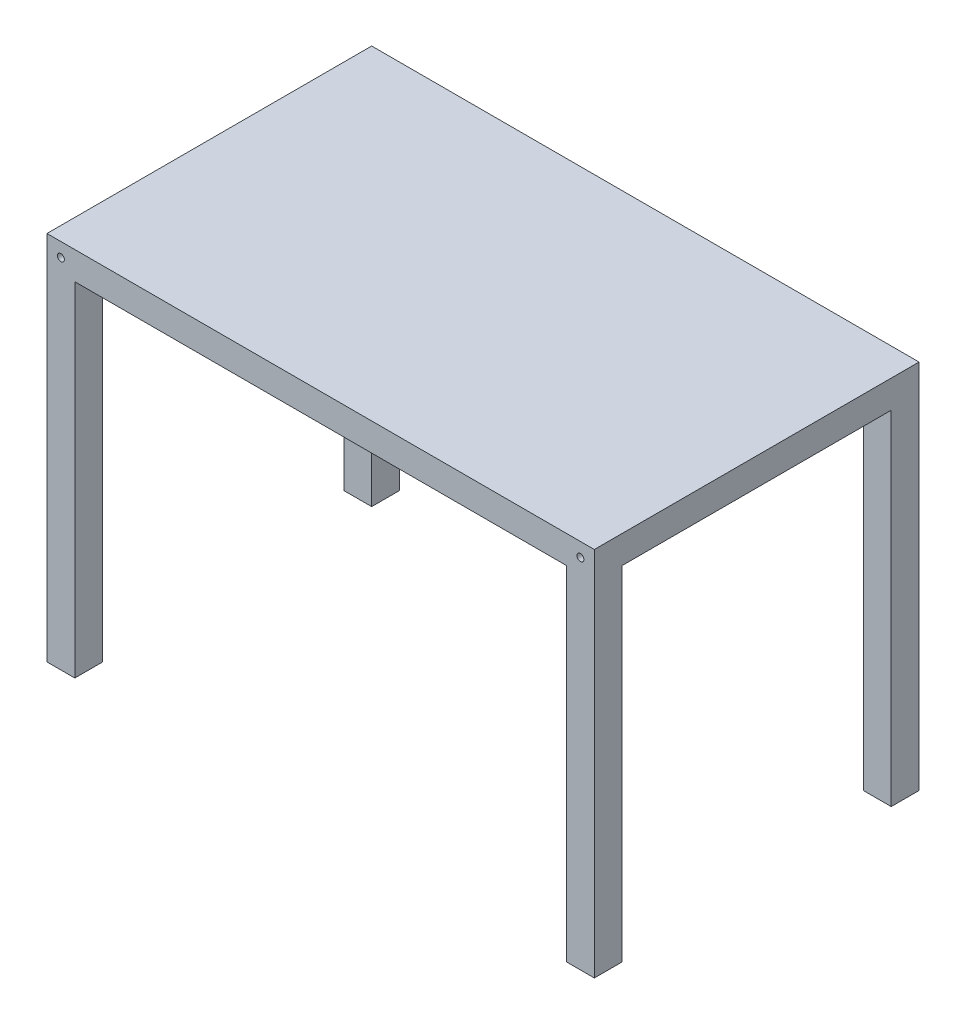
ISO-10303-21;
HEADER;
FILE_DESCRIPTION(('STEP AP214'),'2;1');
FILE_NAME('part.step','',(''),(''),'','','');
FILE_SCHEMA(('AUTOMOTIVE_DESIGN { 1 0 10303 214 1 1 1 1 }'));
ENDSEC;
DATA;
#1=APPLICATION_CONTEXT('core data for automotive mechanical design processes');
#2=APPLICATION_PROTOCOL_DEFINITION('international standard','automotive_design',2000,#1);
#3=PRODUCT_CONTEXT('',#1,'mechanical');
#4=PRODUCT('Part','Part','',(#3));
#5=PRODUCT_RELATED_PRODUCT_CATEGORY('part','',(#4));
#6=PRODUCT_DEFINITION_FORMATION('','',#4);
#7=PRODUCT_DEFINITION_CONTEXT('part definition',#1,'design');
#8=PRODUCT_DEFINITION('design','',#6,#7);
#9=PRODUCT_DEFINITION_SHAPE('','',#8);
#10=(LENGTH_UNIT() NAMED_UNIT(*) SI_UNIT(.MILLI.,.METRE.));
#11=(NAMED_UNIT(*) PLANE_ANGLE_UNIT() SI_UNIT($,.RADIAN.));
#12=(NAMED_UNIT(*) SI_UNIT($,.STERADIAN.) SOLID_ANGLE_UNIT());
#13=UNCERTAINTY_MEASURE_WITH_UNIT(LENGTH_MEASURE(1.E-05),#10,'distance_accuracy_value','');
#14=(GEOMETRIC_REPRESENTATION_CONTEXT(3) GLOBAL_UNCERTAINTY_ASSIGNED_CONTEXT((#13)) GLOBAL_UNIT_ASSIGNED_CONTEXT((#10,
#11,#12)) REPRESENTATION_CONTEXT('',''));
#15=CARTESIAN_POINT('',(0.,0.,0.));
#16=DIRECTION('',(0.,0.,1.));
#17=DIRECTION('',(1.,0.,0.));
#18=AXIS2_PLACEMENT_3D('',#15,#16,#17);
#19=CARTESIAN_POINT('',(1180.,1.27680077282094E-13,700.));
#20=DIRECTION('',(0.,1.,0.));
#21=DIRECTION('',(-1.,0.,0.));
#22=AXIS2_PLACEMENT_3D('',#19,#20,#21);
#23=PLANE('',#22);
#24=DIRECTION('',(-1.,0.,0.));
#25=VECTOR('',#24,1.);
#26=CARTESIAN_POINT('',(1240.,0.,60.0000000000001));
#27=LINE('',#26,#25);
#28=CARTESIAN_POINT('',(60.0000000000001,0.,60.0000000000001));
#29=VERTEX_POINT('',#28);
#30=CARTESIAN_POINT('',(0.,0.,60.0000000000001));
#31=VERTEX_POINT('',#30);
#32=EDGE_CURVE('E175',#29,#31,#27,.T.);
#33=ORIENTED_EDGE('',*,*,#32,.T.);
#34=DIRECTION('',(0.,0.,-1.));
#35=VECTOR('',#34,1.);
#36=CARTESIAN_POINT('',(0.,0.,700.));
#37=LINE('',#36,#35);
#38=CARTESIAN_POINT('',(0.,0.,0.));
#39=VERTEX_POINT('',#38);
#40=EDGE_CURVE('E166',#31,#39,#37,.T.);
#41=ORIENTED_EDGE('',*,*,#40,.T.);
#42=DIRECTION('',(1.,0.,0.));
#43=VECTOR('',#42,1.);
#44=CARTESIAN_POINT('',(1180.,1.27680077282094E-13,0.));
#45=LINE('',#44,#43);
#46=CARTESIAN_POINT('',(60.,0.,0.));
#47=VERTEX_POINT('',#46);
#48=EDGE_CURVE('E234',#39,#47,#45,.T.);
#49=ORIENTED_EDGE('',*,*,#48,.T.);
#50=DIRECTION('',(0.,0.,1.));
#51=VECTOR('',#50,1.);
#52=CARTESIAN_POINT('',(60.,0.,0.));
#53=LINE('',#52,#51);
#54=EDGE_CURVE('E209',#47,#29,#53,.T.);
#55=ORIENTED_EDGE('',*,*,#54,.T.);
#56=EDGE_LOOP('',(#33,#41,#49,#55));
#57=FACE_BOUND('',#56,.T.);
#58=ADVANCED_FACE('F32',(#57),#23,.F.);
#59=DIRECTION('',(-1.,0.,0.));
#60=VECTOR('',#59,1.);
#61=CARTESIAN_POINT('',(1240.,0.,640.));
#62=LINE('',#61,#60);
#63=CARTESIAN_POINT('',(60.0000000000001,0.,640.));
#64=VERTEX_POINT('',#63);
#65=CARTESIAN_POINT('',(0.,0.,640.));
#66=VERTEX_POINT('',#65);
#67=EDGE_CURVE('E178',#64,#66,#62,.T.);
#68=ORIENTED_EDGE('',*,*,#67,.F.);
#69=CARTESIAN_POINT('',(60.,0.,700.));
#70=VERTEX_POINT('',#69);
#71=EDGE_CURVE('E213',#64,#70,#53,.T.);
#72=ORIENTED_EDGE('',*,*,#71,.T.);
#73=DIRECTION('',(1.,0.,0.));
#74=VECTOR('',#73,1.);
#75=CARTESIAN_POINT('',(1180.,1.27680077282094E-13,700.));
#76=LINE('',#75,#74);
#77=CARTESIAN_POINT('',(0.,0.,700.));
#78=VERTEX_POINT('',#77);
#79=EDGE_CURVE('E224',#78,#70,#76,.T.);
#80=ORIENTED_EDGE('',*,*,#79,.F.);
#81=EDGE_CURVE('E243',#78,#66,#37,.T.);
#82=ORIENTED_EDGE('',*,*,#81,.T.);
#83=EDGE_LOOP('',(#68,#72,#80,#82));
#84=FACE_BOUND('',#83,.T.);
#85=ADVANCED_FACE('F277',(#84),#23,.F.);
#86=CARTESIAN_POINT('',(1180.,0.,60.0000000000001));
#87=VERTEX_POINT('',#86);
#88=CARTESIAN_POINT('',(1120.,0.,60.0000000000001));
#89=VERTEX_POINT('',#88);
#90=EDGE_CURVE('E177',#87,#89,#27,.T.);
#91=ORIENTED_EDGE('',*,*,#90,.T.);
#92=DIRECTION('',(0.,0.,1.));
#93=VECTOR('',#92,1.);
#94=CARTESIAN_POINT('',(1120.,0.,0.));
#95=LINE('',#94,#93);
#96=CARTESIAN_POINT('',(1120.,0.,0.));
#97=VERTEX_POINT('',#96);
#98=EDGE_CURVE('E221',#97,#89,#95,.T.);
#99=ORIENTED_EDGE('',*,*,#98,.F.);
#100=CARTESIAN_POINT('',(1180.,1.27680077282094E-13,0.));
#101=VERTEX_POINT('',#100);
#102=EDGE_CURVE('E212',#97,#101,#45,.T.);
#103=ORIENTED_EDGE('',*,*,#102,.T.);
#104=DIRECTION('',(0.,0.,-1.));
#105=VECTOR('',#104,1.);
#106=CARTESIAN_POINT('',(1180.,1.27680077282094E-13,700.));
#107=LINE('',#106,#105);
#108=EDGE_CURVE('E252',#87,#101,#107,.T.);
#109=ORIENTED_EDGE('',*,*,#108,.F.);
#110=EDGE_LOOP('',(#91,#99,#103,#109));
#111=FACE_BOUND('',#110,.T.);
#112=ADVANCED_FACE('F307',(#111),#23,.F.);
#113=CARTESIAN_POINT('',(1180.,0.,640.));
#114=VERTEX_POINT('',#113);
#115=CARTESIAN_POINT('',(1120.,0.,640.));
#116=VERTEX_POINT('',#115);
#117=EDGE_CURVE('E54',#114,#116,#62,.T.);
#118=ORIENTED_EDGE('',*,*,#117,.F.);
#119=CARTESIAN_POINT('',(1180.,1.27680077282094E-13,700.));
#120=VERTEX_POINT('',#119);
#121=EDGE_CURVE('E253',#120,#114,#107,.T.);
#122=ORIENTED_EDGE('',*,*,#121,.F.);
#123=CARTESIAN_POINT('',(1120.,0.,700.));
#124=VERTEX_POINT('',#123);
#125=EDGE_CURVE('E228',#124,#120,#76,.T.);
#126=ORIENTED_EDGE('',*,*,#125,.F.);
#127=EDGE_CURVE('E201',#116,#124,#95,.T.);
#128=ORIENTED_EDGE('',*,*,#127,.F.);
#129=EDGE_LOOP('',(#118,#122,#126,#128));
#130=FACE_BOUND('',#129,.T.);
#131=ADVANCED_FACE('F315',(#130),#23,.F.);
#132=CARTESIAN_POINT('',(1180.,800.,700.));
#133=DIRECTION('',(-1.,0.,0.));
#134=DIRECTION('',(0.,-1.,0.));
#135=AXIS2_PLACEMENT_3D('',#132,#133,#134);
#136=PLANE('',#135);
#137=DIRECTION('',(0.,1.,0.));
#138=VECTOR('',#137,1.);
#139=CARTESIAN_POINT('',(1180.,800.,59.9999999999999));
#140=LINE('',#139,#138);
#141=CARTESIAN_POINT('',(1180.,740.,60.));
#142=VERTEX_POINT('',#141);
#143=EDGE_CURVE('E188',#87,#142,#140,.T.);
#144=ORIENTED_EDGE('',*,*,#143,.F.);
#145=ORIENTED_EDGE('',*,*,#108,.T.);
#146=DIRECTION('',(0.,1.,0.));
#147=VECTOR('',#146,1.);
#148=CARTESIAN_POINT('',(1180.,800.,0.));
#149=LINE('',#148,#147);
#150=CARTESIAN_POINT('',(1180.,800.,0.));
#151=VERTEX_POINT('',#150);
#152=EDGE_CURVE('E237',#101,#151,#149,.T.);
#153=ORIENTED_EDGE('',*,*,#152,.T.);
#154=DIRECTION('',(0.,0.,-1.));
#155=VECTOR('',#154,1.);
#156=CARTESIAN_POINT('',(1180.,800.,700.));
#157=LINE('',#156,#155);
#158=CARTESIAN_POINT('',(1180.,800.,700.));
#159=VERTEX_POINT('',#158);
#160=EDGE_CURVE('E249',#159,#151,#157,.T.);
#161=ORIENTED_EDGE('',*,*,#160,.F.);
#162=DIRECTION('',(0.,1.,0.));
#163=VECTOR('',#162,1.);
#164=CARTESIAN_POINT('',(1180.,800.,700.));
#165=LINE('',#164,#163);
#166=EDGE_CURVE('E227',#120,#159,#165,.T.);
#167=ORIENTED_EDGE('',*,*,#166,.F.);
#168=ORIENTED_EDGE('',*,*,#121,.T.);
#169=DIRECTION('',(0.,-1.,0.));
#170=VECTOR('',#169,1.);
#171=CARTESIAN_POINT('',(1180.,800.,640.));
#172=LINE('',#171,#170);
#173=CARTESIAN_POINT('',(1180.,740.,640.));
#174=VERTEX_POINT('',#173);
#175=EDGE_CURVE('E183',#174,#114,#172,.T.);
#176=ORIENTED_EDGE('',*,*,#175,.F.);
#177=DIRECTION('',(0.,0.,1.));
#178=VECTOR('',#177,1.);
#179=CARTESIAN_POINT('',(1180.,740.,700.));
#180=LINE('',#179,#178);
#181=EDGE_CURVE('E185',#142,#174,#180,.T.);
#182=ORIENTED_EDGE('',*,*,#181,.F.);
#183=EDGE_LOOP('',(#144,#145,#153,#161,#167,#168,#176,#182));
#184=FACE_BOUND('',#183,.T.);
#185=ADVANCED_FACE('F312',(#184),#136,.F.);
#186=CARTESIAN_POINT('',(0.,0.,700.));
#187=DIRECTION('',(1.,0.,0.));
#188=DIRECTION('',(0.,0.,-1.));
#189=AXIS2_PLACEMENT_3D('',#186,#187,#188);
#190=PLANE('',#189);
#191=DIRECTION('',(0.,1.,0.));
#192=VECTOR('',#191,1.);
#193=CARTESIAN_POINT('',(0.,0.,60.0000000000001));
#194=LINE('',#193,#192);
#195=CARTESIAN_POINT('',(0.,740.,60.));
#196=VERTEX_POINT('',#195);
#197=EDGE_CURVE('E146',#31,#196,#194,.T.);
#198=ORIENTED_EDGE('',*,*,#197,.T.);
#199=DIRECTION('',(0.,0.,1.));
#200=VECTOR('',#199,1.);
#201=CARTESIAN_POINT('',(0.,740.,60.));
#202=LINE('',#201,#200);
#203=CARTESIAN_POINT('',(0.,740.,640.));
#204=VERTEX_POINT('',#203);
#205=EDGE_CURVE('E156',#196,#204,#202,.T.);
#206=ORIENTED_EDGE('',*,*,#205,.T.);
#207=DIRECTION('',(0.,-1.,0.));
#208=VECTOR('',#207,1.);
#209=CARTESIAN_POINT('',(0.,740.,640.));
#210=LINE('',#209,#208);
#211=EDGE_CURVE('E161',#204,#66,#210,.T.);
#212=ORIENTED_EDGE('',*,*,#211,.T.);
#213=ORIENTED_EDGE('',*,*,#81,.F.);
#214=DIRECTION('',(0.,-1.,0.));
#215=VECTOR('',#214,1.);
#216=CARTESIAN_POINT('',(0.,0.,700.));
#217=LINE('',#216,#215);
#218=CARTESIAN_POINT('',(0.,800.,700.));
#219=VERTEX_POINT('',#218);
#220=EDGE_CURVE('E232',#219,#78,#217,.T.);
#221=ORIENTED_EDGE('',*,*,#220,.F.);
#222=DIRECTION('',(0.,0.,-1.));
#223=VECTOR('',#222,1.);
#224=CARTESIAN_POINT('',(0.,800.,700.));
#225=LINE('',#224,#223);
#226=CARTESIAN_POINT('',(0.,800.,0.));
#227=VERTEX_POINT('',#226);
#228=EDGE_CURVE('E246',#219,#227,#225,.T.);
#229=ORIENTED_EDGE('',*,*,#228,.T.);
#230=DIRECTION('',(0.,-1.,0.));
#231=VECTOR('',#230,1.);
#232=CARTESIAN_POINT('',(0.,0.,0.));
#233=LINE('',#232,#231);
#234=EDGE_CURVE('E241',#227,#39,#233,.T.);
#235=ORIENTED_EDGE('',*,*,#234,.T.);
#236=ORIENTED_EDGE('',*,*,#40,.F.);
#237=EDGE_LOOP('',(#198,#206,#212,#213,#221,#229,#235,#236));
#238=FACE_BOUND('',#237,.T.);
#239=ADVANCED_FACE('F164',(#238),#190,.F.);
#240=CARTESIAN_POINT('',(60.,0.,0.));
#241=DIRECTION('',(-1.,0.,0.));
#242=DIRECTION('',(0.,0.,1.));
#243=AXIS2_PLACEMENT_3D('',#240,#241,#242);
#244=PLANE('',#243);
#245=DIRECTION('',(0.,1.,0.));
#246=VECTOR('',#245,1.);
#247=CARTESIAN_POINT('',(60.,0.,60.0000000000001));
#248=LINE('',#247,#246);
#249=CARTESIAN_POINT('',(60.0000000000001,740.,60.));
#250=VERTEX_POINT('',#249);
#251=EDGE_CURVE('E149',#29,#250,#248,.T.);
#252=ORIENTED_EDGE('',*,*,#251,.F.);
#253=ORIENTED_EDGE('',*,*,#54,.F.);
#254=DIRECTION('',(0.,-1.,0.));
#255=VECTOR('',#254,1.);
#256=CARTESIAN_POINT('',(60.,0.,0.));
#257=LINE('',#256,#255);
#258=CARTESIAN_POINT('',(60.,740.,0.));
#259=VERTEX_POINT('',#258);
#260=EDGE_CURVE('E198',#259,#47,#257,.T.);
#261=ORIENTED_EDGE('',*,*,#260,.F.);
#262=DIRECTION('',(0.,0.,1.));
#263=VECTOR('',#262,1.);
#264=CARTESIAN_POINT('',(60.,740.,0.));
#265=LINE('',#264,#263);
#266=EDGE_CURVE('E214',#259,#250,#265,.T.);
#267=ORIENTED_EDGE('',*,*,#266,.T.);
#268=EDGE_LOOP('',(#252,#253,#261,#267));
#269=FACE_BOUND('',#268,.T.);
#270=ADVANCED_FACE('F297',(#269),#244,.F.);
#271=DIRECTION('',(0.,-1.,0.));
#272=VECTOR('',#271,1.);
#273=CARTESIAN_POINT('',(60.,0.,640.));
#274=LINE('',#273,#272);
#275=CARTESIAN_POINT('',(60.,740.,640.));
#276=VERTEX_POINT('',#275);
#277=EDGE_CURVE('E181',#276,#64,#274,.T.);
#278=ORIENTED_EDGE('',*,*,#277,.F.);
#279=CARTESIAN_POINT('',(60.,740.,700.));
#280=VERTEX_POINT('',#279);
#281=EDGE_CURVE('E216',#276,#280,#265,.T.);
#282=ORIENTED_EDGE('',*,*,#281,.T.);
#283=DIRECTION('',(0.,-1.,0.));
#284=VECTOR('',#283,1.);
#285=CARTESIAN_POINT('',(60.,0.,700.));
#286=LINE('',#285,#284);
#287=EDGE_CURVE('E195',#280,#70,#286,.T.);
#288=ORIENTED_EDGE('',*,*,#287,.T.);
#289=ORIENTED_EDGE('',*,*,#71,.F.);
#290=EDGE_LOOP('',(#278,#282,#288,#289));
#291=FACE_BOUND('',#290,.T.);
#292=ADVANCED_FACE('F272',(#291),#244,.F.);
#293=CARTESIAN_POINT('',(1120.,740.,0.));
#294=DIRECTION('',(1.,0.,0.));
#295=DIRECTION('',(0.,0.,-1.));
#296=AXIS2_PLACEMENT_3D('',#293,#294,#295);
#297=PLANE('',#296);
#298=DIRECTION('',(0.,-1.,0.));
#299=VECTOR('',#298,1.);
#300=CARTESIAN_POINT('',(1120.,740.,60.));
#301=LINE('',#300,#299);
#302=CARTESIAN_POINT('',(1120.,740.,60.));
#303=VERTEX_POINT('',#302);
#304=EDGE_CURVE('E11',#303,#89,#301,.T.);
#305=ORIENTED_EDGE('',*,*,#304,.F.);
#306=DIRECTION('',(0.,0.,1.));
#307=VECTOR('',#306,1.);
#308=CARTESIAN_POINT('',(1120.,740.,0.));
#309=LINE('',#308,#307);
#310=CARTESIAN_POINT('',(1120.,740.,0.));
#311=VERTEX_POINT('',#310);
#312=EDGE_CURVE('E217',#311,#303,#309,.T.);
#313=ORIENTED_EDGE('',*,*,#312,.F.);
#314=DIRECTION('',(0.,1.,0.));
#315=VECTOR('',#314,1.);
#316=CARTESIAN_POINT('',(1120.,740.,0.));
#317=LINE('',#316,#315);
#318=EDGE_CURVE('E191',#97,#311,#317,.T.);
#319=ORIENTED_EDGE('',*,*,#318,.F.);
#320=ORIENTED_EDGE('',*,*,#98,.T.);
#321=EDGE_LOOP('',(#305,#313,#319,#320));
#322=FACE_BOUND('',#321,.T.);
#323=ADVANCED_FACE('F301',(#322),#297,.F.);
#324=DIRECTION('',(0.,1.,0.));
#325=VECTOR('',#324,1.);
#326=CARTESIAN_POINT('',(1120.,740.,640.));
#327=LINE('',#326,#325);
#328=CARTESIAN_POINT('',(1120.,740.,640.));
#329=VERTEX_POINT('',#328);
#330=EDGE_CURVE('E39',#116,#329,#327,.T.);
#331=ORIENTED_EDGE('',*,*,#330,.F.);
#332=ORIENTED_EDGE('',*,*,#127,.T.);
#333=DIRECTION('',(0.,1.,0.));
#334=VECTOR('',#333,1.);
#335=CARTESIAN_POINT('',(1120.,740.,700.));
#336=LINE('',#335,#334);
#337=CARTESIAN_POINT('',(1120.,740.,700.));
#338=VERTEX_POINT('',#337);
#339=EDGE_CURVE('E190',#124,#338,#336,.T.);
#340=ORIENTED_EDGE('',*,*,#339,.T.);
#341=EDGE_CURVE('E220',#329,#338,#309,.T.);
#342=ORIENTED_EDGE('',*,*,#341,.F.);
#343=EDGE_LOOP('',(#331,#332,#340,#342));
#344=FACE_BOUND('',#343,.T.);
#345=ADVANCED_FACE('F264',(#344),#297,.F.);
#346=CARTESIAN_POINT('',(0.,800.,700.));
#347=DIRECTION('',(0.,-1.,0.));
#348=DIRECTION('',(0.,0.,-1.));
#349=AXIS2_PLACEMENT_3D('',#346,#347,#348);
#350=PLANE('',#349);
#351=DIRECTION('',(-1.,0.,0.));
#352=VECTOR('',#351,1.);
#353=CARTESIAN_POINT('',(0.,800.,0.));
#354=LINE('',#353,#352);
#355=EDGE_CURVE('E239',#151,#227,#354,.T.);
#356=ORIENTED_EDGE('',*,*,#355,.T.);
#357=ORIENTED_EDGE('',*,*,#228,.F.);
#358=DIRECTION('',(-1.,0.,0.));
#359=VECTOR('',#358,1.);
#360=CARTESIAN_POINT('',(0.,800.,700.));
#361=LINE('',#360,#359);
#362=EDGE_CURVE('E230',#159,#219,#361,.T.);
#363=ORIENTED_EDGE('',*,*,#362,.F.);
#364=ORIENTED_EDGE('',*,*,#160,.T.);
#365=EDGE_LOOP('',(#356,#357,#363,#364));
#366=FACE_BOUND('',#365,.T.);
#367=ADVANCED_FACE('F287',(#366),#350,.F.);
#368=CARTESIAN_POINT('',(0.,0.,700.));
#369=DIRECTION('',(0.,0.,-1.));
#370=DIRECTION('',(-1.,0.,0.));
#371=AXIS2_PLACEMENT_3D('',#368,#369,#370);
#372=PLANE('',#371);
#373=CARTESIAN_POINT('',(1150.,770.,700.));
#374=DIRECTION('',(0.,0.,1.));
#375=DIRECTION('',(1.,0.,0.));
#376=AXIS2_PLACEMENT_3D('',#373,#374,#375);
#377=CIRCLE('',#376,7.49999999999996);
#378=CARTESIAN_POINT('',(1157.5,770.,700.));
#379=VERTEX_POINT('',#378);
#380=EDGE_CURVE('E498',#379,#379,#377,.T.);
#381=ORIENTED_EDGE('',*,*,#380,.F.);
#382=EDGE_LOOP('',(#381));
#383=FACE_BOUND('',#382,.T.);
#384=CARTESIAN_POINT('',(30.,770.,700.));
#385=DIRECTION('',(0.,0.,1.));
#386=DIRECTION('',(1.,0.,0.));
#387=AXIS2_PLACEMENT_3D('',#384,#385,#386);
#388=CIRCLE('',#387,7.5);
#389=CARTESIAN_POINT('',(37.5,770.,700.));
#390=VERTEX_POINT('',#389);
#391=EDGE_CURVE('E170',#390,#390,#388,.T.);
#392=ORIENTED_EDGE('',*,*,#391,.F.);
#393=EDGE_LOOP('',(#392));
#394=FACE_BOUND('',#393,.T.);
#395=ORIENTED_EDGE('',*,*,#79,.T.);
#396=ORIENTED_EDGE('',*,*,#287,.F.);
#397=DIRECTION('',(-1.,0.,0.));
#398=VECTOR('',#397,1.);
#399=CARTESIAN_POINT('',(60.,740.,700.));
#400=LINE('',#399,#398);
#401=EDGE_CURVE('E204',#338,#280,#400,.T.);
#402=ORIENTED_EDGE('',*,*,#401,.F.);
#403=ORIENTED_EDGE('',*,*,#339,.F.);
#404=ORIENTED_EDGE('',*,*,#125,.T.);
#405=ORIENTED_EDGE('',*,*,#166,.T.);
#406=ORIENTED_EDGE('',*,*,#362,.T.);
#407=ORIENTED_EDGE('',*,*,#220,.T.);
#408=EDGE_LOOP('',(#395,#396,#402,#403,#404,#405,#406,#407));
#409=FACE_BOUND('',#408,.T.);
#410=ADVANCED_FACE('F270',(#383,#394,#409),#372,.F.);
#411=CARTESIAN_POINT('',(0.,0.,0.));
#412=DIRECTION('',(0.,0.,-1.));
#413=DIRECTION('',(-1.,0.,0.));
#414=AXIS2_PLACEMENT_3D('',#411,#412,#413);
#415=PLANE('',#414);
#416=ORIENTED_EDGE('',*,*,#260,.T.);
#417=ORIENTED_EDGE('',*,*,#48,.F.);
#418=ORIENTED_EDGE('',*,*,#234,.F.);
#419=ORIENTED_EDGE('',*,*,#355,.F.);
#420=ORIENTED_EDGE('',*,*,#152,.F.);
#421=ORIENTED_EDGE('',*,*,#102,.F.);
#422=ORIENTED_EDGE('',*,*,#318,.T.);
#423=DIRECTION('',(-1.,0.,0.));
#424=VECTOR('',#423,1.);
#425=CARTESIAN_POINT('',(60.,740.,0.));
#426=LINE('',#425,#424);
#427=EDGE_CURVE('E194',#311,#259,#426,.T.);
#428=ORIENTED_EDGE('',*,*,#427,.T.);
#429=EDGE_LOOP('',(#416,#417,#418,#419,#420,#421,#422,#428));
#430=FACE_BOUND('',#429,.T.);
#431=ADVANCED_FACE('F291',(#430),#415,.T.);
#432=CARTESIAN_POINT('',(60.,740.,0.));
#433=DIRECTION('',(0.,1.,0.));
#434=DIRECTION('',(0.,0.,1.));
#435=AXIS2_PLACEMENT_3D('',#432,#433,#434);
#436=PLANE('',#435);
#437=ORIENTED_EDGE('',*,*,#281,.F.);
#438=DIRECTION('',(-1.,0.,0.));
#439=VECTOR('',#438,1.);
#440=CARTESIAN_POINT('',(1240.,740.,640.));
#441=LINE('',#440,#439);
#442=EDGE_CURVE('E46',#276,#204,#441,.T.);
#443=ORIENTED_EDGE('',*,*,#442,.T.);
#444=ORIENTED_EDGE('',*,*,#205,.F.);
#445=DIRECTION('',(-1.,0.,0.));
#446=VECTOR('',#445,1.);
#447=CARTESIAN_POINT('',(1240.,740.,60.));
#448=LINE('',#447,#446);
#449=EDGE_CURVE('E142',#250,#196,#448,.T.);
#450=ORIENTED_EDGE('',*,*,#449,.F.);
#451=ORIENTED_EDGE('',*,*,#266,.F.);
#452=ORIENTED_EDGE('',*,*,#427,.F.);
#453=ORIENTED_EDGE('',*,*,#312,.T.);
#454=EDGE_CURVE('E152',#142,#303,#448,.T.);
#455=ORIENTED_EDGE('',*,*,#454,.F.);
#456=ORIENTED_EDGE('',*,*,#181,.T.);
#457=EDGE_CURVE('E153',#174,#329,#441,.T.);
#458=ORIENTED_EDGE('',*,*,#457,.T.);
#459=ORIENTED_EDGE('',*,*,#341,.T.);
#460=ORIENTED_EDGE('',*,*,#401,.T.);
#461=EDGE_LOOP('',(#437,#443,#444,#450,#451,#452,#453,#455,#456,#458,#459,#460));
#462=FACE_BOUND('',#461,.T.);
#463=ADVANCED_FACE('F158',(#462),#436,.F.);
#464=CARTESIAN_POINT('',(1240.,740.,640.));
#465=DIRECTION('',(0.,0.,-1.));
#466=DIRECTION('',(0.,1.,0.));
#467=AXIS2_PLACEMENT_3D('',#464,#465,#466);
#468=PLANE('',#467);
#469=ORIENTED_EDGE('',*,*,#175,.T.);
#470=ORIENTED_EDGE('',*,*,#117,.T.);
#471=ORIENTED_EDGE('',*,*,#330,.T.);
#472=ORIENTED_EDGE('',*,*,#457,.F.);
#473=EDGE_LOOP('',(#469,#470,#471,#472));
#474=FACE_BOUND('',#473,.T.);
#475=ADVANCED_FACE('F257',(#474),#468,.T.);
#476=CARTESIAN_POINT('',(1240.,0.,60.0000000000001));
#477=DIRECTION('',(0.,0.,1.));
#478=DIRECTION('',(0.,-1.,0.));
#479=AXIS2_PLACEMENT_3D('',#476,#477,#478);
#480=PLANE('',#479);
#481=ORIENTED_EDGE('',*,*,#143,.T.);
#482=ORIENTED_EDGE('',*,*,#454,.T.);
#483=ORIENTED_EDGE('',*,*,#304,.T.);
#484=ORIENTED_EDGE('',*,*,#90,.F.);
#485=EDGE_LOOP('',(#481,#482,#483,#484));
#486=FACE_BOUND('',#485,.T.);
#487=ADVANCED_FACE('F310',(#486),#480,.T.);
#488=ORIENTED_EDGE('',*,*,#251,.T.);
#489=ORIENTED_EDGE('',*,*,#449,.T.);
#490=ORIENTED_EDGE('',*,*,#197,.F.);
#491=ORIENTED_EDGE('',*,*,#32,.F.);
#492=EDGE_LOOP('',(#488,#489,#490,#491));
#493=FACE_BOUND('',#492,.T.);
#494=ADVANCED_FACE('F144',(#493),#480,.T.);
#495=ORIENTED_EDGE('',*,*,#277,.T.);
#496=ORIENTED_EDGE('',*,*,#67,.T.);
#497=ORIENTED_EDGE('',*,*,#211,.F.);
#498=ORIENTED_EDGE('',*,*,#442,.F.);
#499=EDGE_LOOP('',(#495,#496,#497,#498));
#500=FACE_BOUND('',#499,.T.);
#501=ADVANCED_FACE('F275',(#500),#468,.T.);
#502=CARTESIAN_POINT('',(30.,770.,650.));
#503=DIRECTION('',(0.,0.,1.));
#504=DIRECTION('',(1.,0.,0.));
#505=AXIS2_PLACEMENT_3D('',#502,#503,#504);
#506=CYLINDRICAL_SURFACE('',#505,7.5);
#507=CARTESIAN_POINT('',(30.,770.,650.));
#508=DIRECTION('',(0.,0.,1.));
#509=DIRECTION('',(1.,0.,0.));
#510=AXIS2_PLACEMENT_3D('',#507,#508,#509);
#511=CIRCLE('',#510,7.5);
#512=CARTESIAN_POINT('',(37.5,770.,650.));
#513=VERTEX_POINT('',#512);
#514=EDGE_CURVE('E167',#513,#513,#511,.T.);
#515=ORIENTED_EDGE('',*,*,#514,.F.);
#516=EDGE_LOOP('',(#515));
#517=FACE_BOUND('',#516,.T.);
#518=ORIENTED_EDGE('',*,*,#391,.T.);
#519=EDGE_LOOP('',(#518));
#520=FACE_BOUND('',#519,.T.);
#521=ADVANCED_FACE('F423',(#517,#520),#506,.F.);
#522=CARTESIAN_POINT('',(30.,770.,650.));
#523=DIRECTION('',(0.,0.,1.));
#524=DIRECTION('',(1.,0.,0.));
#525=AXIS2_PLACEMENT_3D('',#522,#523,#524);
#526=PLANE('',#525);
#527=ORIENTED_EDGE('',*,*,#514,.T.);
#528=EDGE_LOOP('',(#527));
#529=FACE_BOUND('',#528,.T.);
#530=ADVANCED_FACE('F442',(#529),#526,.T.);
#531=CARTESIAN_POINT('',(1150.,770.,650.));
#532=DIRECTION('',(0.,0.,1.));
#533=DIRECTION('',(1.,0.,0.));
#534=AXIS2_PLACEMENT_3D('',#531,#532,#533);
#535=CYLINDRICAL_SURFACE('',#534,7.49999999999996);
#536=CARTESIAN_POINT('',(1150.,770.,650.));
#537=DIRECTION('',(0.,0.,1.));
#538=DIRECTION('',(1.,0.,0.));
#539=AXIS2_PLACEMENT_3D('',#536,#537,#538);
#540=CIRCLE('',#539,7.49999999999996);
#541=CARTESIAN_POINT('',(1157.5,770.,650.));
#542=VERTEX_POINT('',#541);
#543=EDGE_CURVE('E497',#542,#542,#540,.T.);
#544=ORIENTED_EDGE('',*,*,#543,.F.);
#545=EDGE_LOOP('',(#544));
#546=FACE_BOUND('',#545,.T.);
#547=ORIENTED_EDGE('',*,*,#380,.T.);
#548=EDGE_LOOP('',(#547));
#549=FACE_BOUND('',#548,.T.);
#550=ADVANCED_FACE('F452',(#546,#549),#535,.F.);
#551=CARTESIAN_POINT('',(1150.,770.,650.));
#552=DIRECTION('',(0.,0.,1.));
#553=DIRECTION('',(1.,0.,0.));
#554=AXIS2_PLACEMENT_3D('',#551,#552,#553);
#555=PLANE('',#554);
#556=ORIENTED_EDGE('',*,*,#543,.T.);
#557=EDGE_LOOP('',(#556));
#558=FACE_BOUND('',#557,.T.);
#559=ADVANCED_FACE('F462',(#558),#555,.T.);
#560=CLOSED_SHELL('',(#58,#85,#112,#131,#185,#239,#270,#292,#323,#345,#367,#410,#431,#463,#475,
#487,#494,#501,#521,#530,#550,#559));
#561=MANIFOLD_SOLID_BREP('B2',#560);
#562=ADVANCED_BREP_SHAPE_REPRESENTATION('',(#18,#561),#14);
#563=SHAPE_DEFINITION_REPRESENTATION(#9,#562);
ENDSEC;
END-ISO-10303-21;
